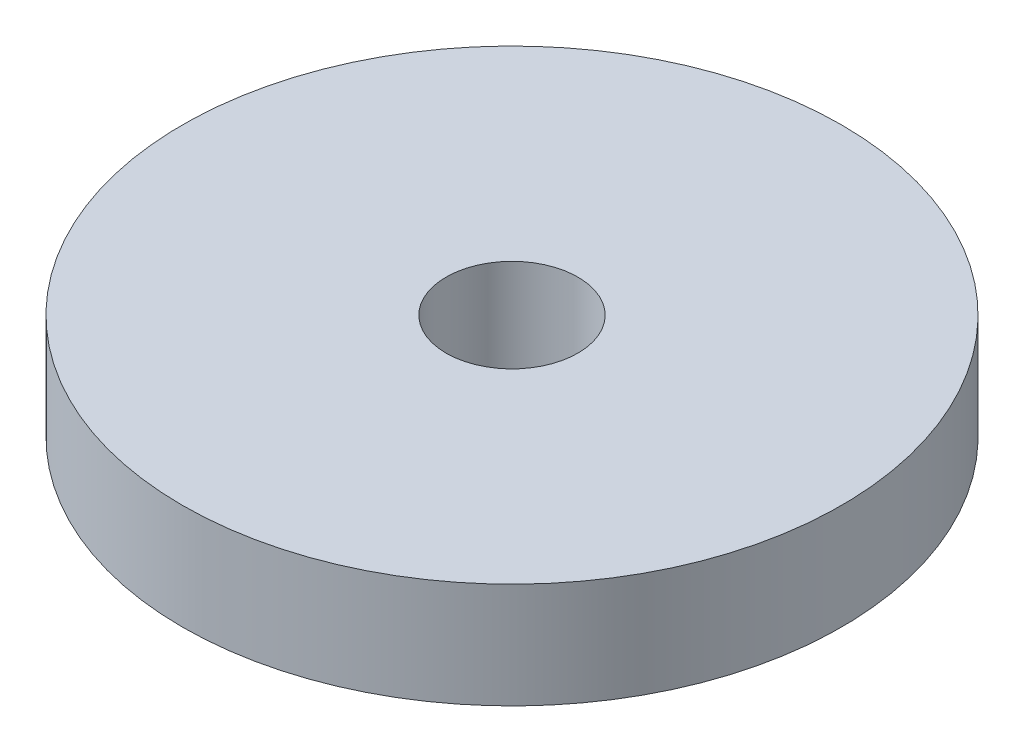
ISO-10303-21;
HEADER;
FILE_DESCRIPTION(('STEP AP214'),'2;1');
FILE_NAME('part.step','',(''),(''),'','','');
FILE_SCHEMA(('AUTOMOTIVE_DESIGN { 1 0 10303 214 1 1 1 1 }'));
ENDSEC;
DATA;
#1=APPLICATION_CONTEXT('core data for automotive mechanical design processes');
#2=APPLICATION_PROTOCOL_DEFINITION('international standard','automotive_design',2000,#1);
#3=PRODUCT_CONTEXT('',#1,'mechanical');
#4=PRODUCT('Part','Part','',(#3));
#5=PRODUCT_RELATED_PRODUCT_CATEGORY('part','',(#4));
#6=PRODUCT_DEFINITION_FORMATION('','',#4);
#7=PRODUCT_DEFINITION_CONTEXT('part definition',#1,'design');
#8=PRODUCT_DEFINITION('design','',#6,#7);
#9=PRODUCT_DEFINITION_SHAPE('','',#8);
#10=(LENGTH_UNIT() NAMED_UNIT(*) SI_UNIT(.MILLI.,.METRE.));
#11=(NAMED_UNIT(*) PLANE_ANGLE_UNIT() SI_UNIT($,.RADIAN.));
#12=(NAMED_UNIT(*) SI_UNIT($,.STERADIAN.) SOLID_ANGLE_UNIT());
#13=UNCERTAINTY_MEASURE_WITH_UNIT(LENGTH_MEASURE(1.E-05),#10,'distance_accuracy_value','');
#14=(GEOMETRIC_REPRESENTATION_CONTEXT(3) GLOBAL_UNCERTAINTY_ASSIGNED_CONTEXT((#13)) GLOBAL_UNIT_ASSIGNED_CONTEXT((#10,
#11,#12)) REPRESENTATION_CONTEXT('',''));
#15=CARTESIAN_POINT('',(0.,0.,0.));
#16=DIRECTION('',(0.,0.,1.));
#17=DIRECTION('',(1.,0.,0.));
#18=AXIS2_PLACEMENT_3D('',#15,#16,#17);
#19=CARTESIAN_POINT('',(0.,5.08,0.));
#20=DIRECTION('',(0.,1.,0.));
#21=DIRECTION('',(0.,0.,1.));
#22=AXIS2_PLACEMENT_3D('',#19,#20,#21);
#23=PLANE('',#22);
#24=CARTESIAN_POINT('',(0.,5.08,0.));
#25=DIRECTION('',(0.,1.,0.));
#26=DIRECTION('',(0.,0.,1.));
#27=AXIS2_PLACEMENT_3D('',#24,#25,#26);
#28=CIRCLE('',#27,15.875);
#29=CARTESIAN_POINT('',(0.,5.08,15.875));
#30=VERTEX_POINT('',#29);
#31=EDGE_CURVE('E10',#30,#30,#28,.T.);
#32=ORIENTED_EDGE('',*,*,#31,.T.);
#33=EDGE_LOOP('',(#32));
#34=FACE_BOUND('',#33,.T.);
#35=CARTESIAN_POINT('',(0.,5.08,0.));
#36=DIRECTION('',(0.,1.,0.));
#37=DIRECTION('',(0.,0.,1.));
#38=AXIS2_PLACEMENT_3D('',#35,#36,#37);
#39=CIRCLE('',#38,3.175);
#40=CARTESIAN_POINT('',(0.,5.08,3.175));
#41=VERTEX_POINT('',#40);
#42=EDGE_CURVE('E56',#41,#41,#39,.T.);
#43=ORIENTED_EDGE('',*,*,#42,.F.);
#44=EDGE_LOOP('',(#43));
#45=FACE_BOUND('',#44,.T.);
#46=ADVANCED_FACE('F43',(#34,#45),#23,.T.);
#47=CARTESIAN_POINT('',(0.,0.,0.));
#48=DIRECTION('',(0.,1.,0.));
#49=DIRECTION('',(0.,0.,1.));
#50=AXIS2_PLACEMENT_3D('',#47,#48,#49);
#51=PLANE('',#50);
#52=CARTESIAN_POINT('',(0.,0.,0.));
#53=DIRECTION('',(0.,1.,0.));
#54=DIRECTION('',(0.,0.,1.));
#55=AXIS2_PLACEMENT_3D('',#52,#53,#54);
#56=CIRCLE('',#55,15.875);
#57=CARTESIAN_POINT('',(0.,0.,15.875));
#58=VERTEX_POINT('',#57);
#59=EDGE_CURVE('E47',#58,#58,#56,.T.);
#60=ORIENTED_EDGE('',*,*,#59,.F.);
#61=EDGE_LOOP('',(#60));
#62=FACE_BOUND('',#61,.T.);
#63=CARTESIAN_POINT('',(0.,0.,0.));
#64=DIRECTION('',(0.,1.,0.));
#65=DIRECTION('',(0.,0.,1.));
#66=AXIS2_PLACEMENT_3D('',#63,#64,#65);
#67=CIRCLE('',#66,3.175);
#68=CARTESIAN_POINT('',(0.,0.,3.175));
#69=VERTEX_POINT('',#68);
#70=EDGE_CURVE('E58',#69,#69,#67,.T.);
#71=ORIENTED_EDGE('',*,*,#70,.T.);
#72=EDGE_LOOP('',(#71));
#73=FACE_BOUND('',#72,.T.);
#74=ADVANCED_FACE('F70',(#62,#73),#51,.F.);
#75=CARTESIAN_POINT('',(0.,5.08,0.));
#76=DIRECTION('',(0.,-1.,0.));
#77=DIRECTION('',(0.,0.,-1.));
#78=AXIS2_PLACEMENT_3D('',#75,#76,#77);
#79=CYLINDRICAL_SURFACE('',#78,15.875);
#80=ORIENTED_EDGE('',*,*,#31,.F.);
#81=EDGE_LOOP('',(#80));
#82=FACE_BOUND('',#81,.T.);
#83=ORIENTED_EDGE('',*,*,#59,.T.);
#84=EDGE_LOOP('',(#83));
#85=FACE_BOUND('',#84,.T.);
#86=ADVANCED_FACE('F45',(#82,#85),#79,.T.);
#87=CARTESIAN_POINT('',(0.,5.08,0.));
#88=DIRECTION('',(0.,-1.,0.));
#89=DIRECTION('',(0.,0.,-1.));
#90=AXIS2_PLACEMENT_3D('',#87,#88,#89);
#91=CYLINDRICAL_SURFACE('',#90,3.175);
#92=ORIENTED_EDGE('',*,*,#42,.T.);
#93=EDGE_LOOP('',(#92));
#94=FACE_BOUND('',#93,.T.);
#95=ORIENTED_EDGE('',*,*,#70,.F.);
#96=EDGE_LOOP('',(#95));
#97=FACE_BOUND('',#96,.T.);
#98=ADVANCED_FACE('F66',(#94,#97),#91,.F.);
#99=CLOSED_SHELL('',(#46,#74,#86,#98));
#100=MANIFOLD_SOLID_BREP('B2',#99);
#101=ADVANCED_BREP_SHAPE_REPRESENTATION('',(#18,#100),#14);
#102=SHAPE_DEFINITION_REPRESENTATION(#9,#101);
ENDSEC;
END-ISO-10303-21;
